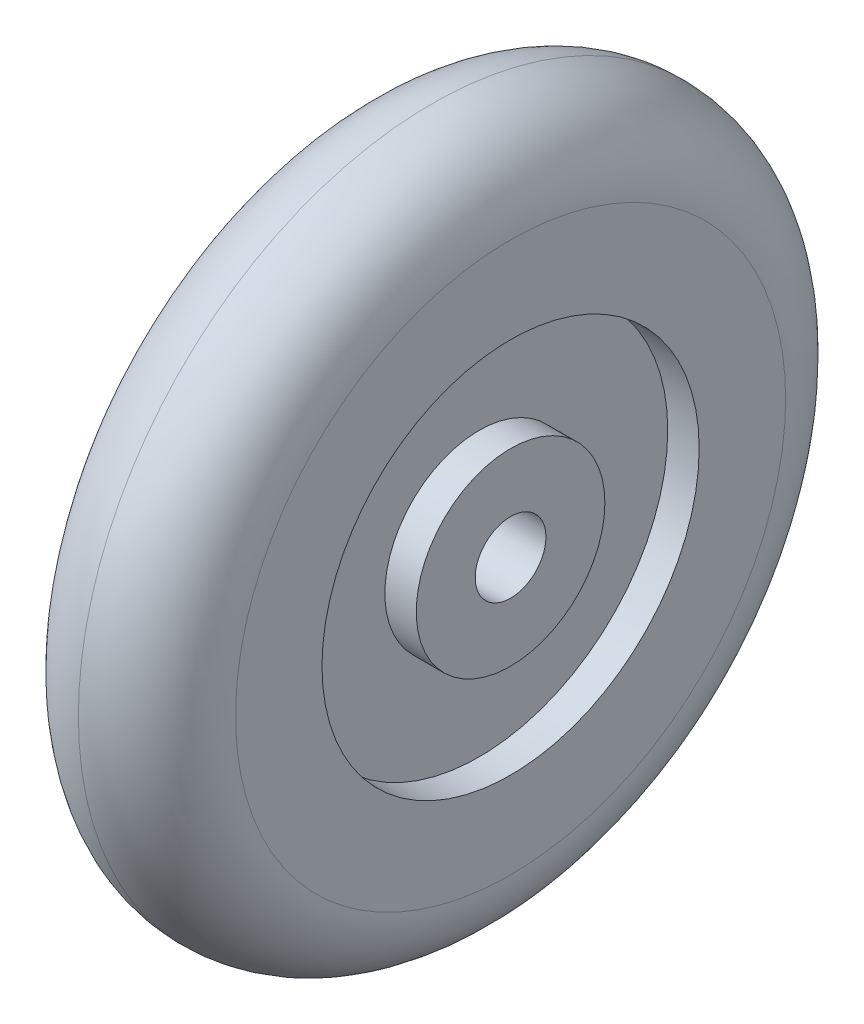
ISO-10303-21;
HEADER;
FILE_DESCRIPTION(('STEP AP214'),'2;1');
FILE_NAME('part.step','',(''),(''),'','','');
FILE_SCHEMA(('AUTOMOTIVE_DESIGN { 1 0 10303 214 1 1 1 1 }'));
ENDSEC;
DATA;
#1=APPLICATION_CONTEXT('core data for automotive mechanical design processes');
#2=APPLICATION_PROTOCOL_DEFINITION('international standard','automotive_design',2000,#1);
#3=PRODUCT_CONTEXT('',#1,'mechanical');
#4=PRODUCT('Part','Part','',(#3));
#5=PRODUCT_RELATED_PRODUCT_CATEGORY('part','',(#4));
#6=PRODUCT_DEFINITION_FORMATION('','',#4);
#7=PRODUCT_DEFINITION_CONTEXT('part definition',#1,'design');
#8=PRODUCT_DEFINITION('design','',#6,#7);
#9=PRODUCT_DEFINITION_SHAPE('','',#8);
#10=(LENGTH_UNIT() NAMED_UNIT(*) SI_UNIT(.MILLI.,.METRE.));
#11=(NAMED_UNIT(*) PLANE_ANGLE_UNIT() SI_UNIT($,.RADIAN.));
#12=(NAMED_UNIT(*) SI_UNIT($,.STERADIAN.) SOLID_ANGLE_UNIT());
#13=UNCERTAINTY_MEASURE_WITH_UNIT(LENGTH_MEASURE(1.E-05),#10,'distance_accuracy_value','');
#14=(GEOMETRIC_REPRESENTATION_CONTEXT(3) GLOBAL_UNCERTAINTY_ASSIGNED_CONTEXT((#13)) GLOBAL_UNIT_ASSIGNED_CONTEXT((#10,
#11,#12)) REPRESENTATION_CONTEXT('',''));
#15=CARTESIAN_POINT('',(0.,0.,0.));
#16=DIRECTION('',(0.,0.,1.));
#17=DIRECTION('',(1.,0.,0.));
#18=AXIS2_PLACEMENT_3D('',#15,#16,#17);
#19=CARTESIAN_POINT('',(5.,0.,0.));
#20=DIRECTION('',(1.,0.,0.));
#21=DIRECTION('',(0.,0.,-1.));
#22=AXIS2_PLACEMENT_3D('',#19,#20,#21);
#23=PLANE('',#22);
#24=CARTESIAN_POINT('',(5.,0.,0.));
#25=DIRECTION('',(1.,0.,0.));
#26=DIRECTION('',(0.,0.,-1.));
#27=AXIS2_PLACEMENT_3D('',#24,#25,#26);
#28=CIRCLE('',#27,12.);
#29=CARTESIAN_POINT('',(5.,0.,-12.));
#30=VERTEX_POINT('',#29);
#31=EDGE_CURVE('E61',#30,#30,#28,.T.);
#32=ORIENTED_EDGE('',*,*,#31,.F.);
#33=EDGE_LOOP('',(#32));
#34=FACE_BOUND('',#33,.T.);
#35=CARTESIAN_POINT('',(5.,0.,0.));
#36=DIRECTION('',(1.,0.,0.));
#37=DIRECTION('',(0.,0.,-1.));
#38=AXIS2_PLACEMENT_3D('',#35,#36,#37);
#39=CIRCLE('',#38,17.5);
#40=CARTESIAN_POINT('',(5.,0.,-17.5));
#41=VERTEX_POINT('',#40);
#42=EDGE_CURVE('E10',#41,#41,#39,.T.);
#43=ORIENTED_EDGE('',*,*,#42,.T.);
#44=EDGE_LOOP('',(#43));
#45=FACE_BOUND('',#44,.T.);
#46=ADVANCED_FACE('F50',(#34,#45),#23,.T.);
#47=CARTESIAN_POINT('',(-5.,0.,0.));
#48=DIRECTION('',(1.,0.,0.));
#49=DIRECTION('',(0.,0.,-1.));
#50=AXIS2_PLACEMENT_3D('',#47,#48,#49);
#51=PLANE('',#50);
#52=CARTESIAN_POINT('',(-5.,0.,0.));
#53=DIRECTION('',(1.,0.,0.));
#54=DIRECTION('',(0.,0.,-1.));
#55=AXIS2_PLACEMENT_3D('',#52,#53,#54);
#56=CIRCLE('',#55,12.);
#57=CARTESIAN_POINT('',(-5.,0.,-12.));
#58=VERTEX_POINT('',#57);
#59=EDGE_CURVE('E82',#58,#58,#56,.T.);
#60=ORIENTED_EDGE('',*,*,#59,.T.);
#61=EDGE_LOOP('',(#60));
#62=FACE_BOUND('',#61,.T.);
#63=CARTESIAN_POINT('',(-5.,0.,0.));
#64=DIRECTION('',(1.,0.,0.));
#65=DIRECTION('',(0.,0.,-1.));
#66=AXIS2_PLACEMENT_3D('',#63,#64,#65);
#67=CIRCLE('',#66,17.5);
#68=CARTESIAN_POINT('',(-5.,0.,-17.5));
#69=VERTEX_POINT('',#68);
#70=EDGE_CURVE('E57',#69,#69,#67,.F.);
#71=ORIENTED_EDGE('',*,*,#70,.T.);
#72=EDGE_LOOP('',(#71));
#73=FACE_BOUND('',#72,.T.);
#74=ADVANCED_FACE('F136',(#62,#73),#51,.F.);
#75=CARTESIAN_POINT('',(0.,0.,0.));
#76=DIRECTION('',(1.,0.,0.));
#77=DIRECTION('',(0.,0.,-1.));
#78=AXIS2_PLACEMENT_3D('',#75,#76,#77);
#79=TOROIDAL_SURFACE('',#78,17.5,5.);
#80=ORIENTED_EDGE('',*,*,#42,.F.);
#81=EDGE_LOOP('',(#80));
#82=FACE_BOUND('',#81,.T.);
#83=CARTESIAN_POINT('',(0.,0.,0.));
#84=DIRECTION('',(1.,0.,0.));
#85=DIRECTION('',(0.,0.,-1.));
#86=AXIS2_PLACEMENT_3D('',#83,#84,#85);
#87=CIRCLE('',#86,22.5);
#88=CARTESIAN_POINT('',(0.,0.,-22.5));
#89=VERTEX_POINT('',#88);
#90=EDGE_CURVE('E51',#89,#89,#87,.F.);
#91=ORIENTED_EDGE('',*,*,#90,.F.);
#92=EDGE_LOOP('',(#91));
#93=FACE_BOUND('',#92,.T.);
#94=ADVANCED_FACE('F47',(#82,#93),#79,.T.);
#95=CARTESIAN_POINT('',(0.,0.,0.));
#96=DIRECTION('',(1.,0.,0.));
#97=DIRECTION('',(0.,0.,-1.));
#98=AXIS2_PLACEMENT_3D('',#95,#96,#97);
#99=TOROIDAL_SURFACE('',#98,17.5,5.);
#100=ORIENTED_EDGE('',*,*,#70,.F.);
#101=EDGE_LOOP('',(#100));
#102=FACE_BOUND('',#101,.T.);
#103=ORIENTED_EDGE('',*,*,#90,.T.);
#104=EDGE_LOOP('',(#103));
#105=FACE_BOUND('',#104,.T.);
#106=ADVANCED_FACE('F143',(#102,#105),#99,.T.);
#107=CARTESIAN_POINT('',(3.,0.,0.));
#108=DIRECTION('',(1.,0.,0.));
#109=DIRECTION('',(0.,0.,-1.));
#110=AXIS2_PLACEMENT_3D('',#107,#108,#109);
#111=CYLINDRICAL_SURFACE('',#110,12.);
#112=CARTESIAN_POINT('',(3.,0.,0.));
#113=DIRECTION('',(1.,0.,0.));
#114=DIRECTION('',(0.,0.,-1.));
#115=AXIS2_PLACEMENT_3D('',#112,#113,#114);
#116=CIRCLE('',#115,12.);
#117=CARTESIAN_POINT('',(3.,0.,-12.));
#118=VERTEX_POINT('',#117);
#119=EDGE_CURVE('E67',#118,#118,#116,.T.);
#120=ORIENTED_EDGE('',*,*,#119,.F.);
#121=EDGE_LOOP('',(#120));
#122=FACE_BOUND('',#121,.T.);
#123=ORIENTED_EDGE('',*,*,#31,.T.);
#124=EDGE_LOOP('',(#123));
#125=FACE_BOUND('',#124,.T.);
#126=ADVANCED_FACE('F133',(#122,#125),#111,.F.);
#127=CARTESIAN_POINT('',(3.,0.,0.));
#128=DIRECTION('',(1.,0.,0.));
#129=DIRECTION('',(0.,0.,-1.));
#130=AXIS2_PLACEMENT_3D('',#127,#128,#129);
#131=PLANE('',#130);
#132=CARTESIAN_POINT('',(3.,0.,0.));
#133=DIRECTION('',(1.,0.,0.));
#134=DIRECTION('',(0.,0.,-1.));
#135=AXIS2_PLACEMENT_3D('',#132,#133,#134);
#136=CIRCLE('',#135,6.);
#137=CARTESIAN_POINT('',(3.,0.,-6.));
#138=VERTEX_POINT('',#137);
#139=EDGE_CURVE('E70',#138,#138,#136,.T.);
#140=ORIENTED_EDGE('',*,*,#139,.F.);
#141=EDGE_LOOP('',(#140));
#142=FACE_BOUND('',#141,.T.);
#143=ORIENTED_EDGE('',*,*,#119,.T.);
#144=EDGE_LOOP('',(#143));
#145=FACE_BOUND('',#144,.T.);
#146=ADVANCED_FACE('F121',(#142,#145),#131,.T.);
#147=CARTESIAN_POINT('',(3.,0.,0.));
#148=DIRECTION('',(1.,0.,0.));
#149=DIRECTION('',(0.,0.,-1.));
#150=AXIS2_PLACEMENT_3D('',#147,#148,#149);
#151=CYLINDRICAL_SURFACE('',#150,6.);
#152=ORIENTED_EDGE('',*,*,#139,.T.);
#153=EDGE_LOOP('',(#152));
#154=FACE_BOUND('',#153,.T.);
#155=CARTESIAN_POINT('',(5.,0.,0.));
#156=DIRECTION('',(1.,0.,0.));
#157=DIRECTION('',(0.,0.,-1.));
#158=AXIS2_PLACEMENT_3D('',#155,#156,#157);
#159=CIRCLE('',#158,6.);
#160=CARTESIAN_POINT('',(5.,0.,-6.));
#161=VERTEX_POINT('',#160);
#162=EDGE_CURVE('E72',#161,#161,#159,.T.);
#163=ORIENTED_EDGE('',*,*,#162,.F.);
#164=EDGE_LOOP('',(#163));
#165=FACE_BOUND('',#164,.T.);
#166=ADVANCED_FACE('F118',(#154,#165),#151,.T.);
#167=CARTESIAN_POINT('',(5.,0.,0.));
#168=DIRECTION('',(1.,0.,0.));
#169=DIRECTION('',(0.,0.,-1.));
#170=AXIS2_PLACEMENT_3D('',#167,#168,#169);
#171=CIRCLE('',#170,2.25);
#172=CARTESIAN_POINT('',(5.,0.,-2.25));
#173=VERTEX_POINT('',#172);
#174=EDGE_CURVE('E97',#173,#173,#171,.T.);
#175=ORIENTED_EDGE('',*,*,#174,.F.);
#176=EDGE_LOOP('',(#175));
#177=FACE_BOUND('',#176,.T.);
#178=ORIENTED_EDGE('',*,*,#162,.T.);
#179=EDGE_LOOP('',(#178));
#180=FACE_BOUND('',#179,.T.);
#181=ADVANCED_FACE('F114',(#177,#180),#23,.T.);
#182=CARTESIAN_POINT('',(-3.,0.,0.));
#183=DIRECTION('',(-1.,0.,0.));
#184=DIRECTION('',(0.,0.,-1.));
#185=AXIS2_PLACEMENT_3D('',#182,#183,#184);
#186=PLANE('',#185);
#187=CARTESIAN_POINT('',(-3.,0.,0.));
#188=DIRECTION('',(1.,0.,0.));
#189=DIRECTION('',(0.,0.,-1.));
#190=AXIS2_PLACEMENT_3D('',#187,#188,#189);
#191=CIRCLE('',#190,12.);
#192=CARTESIAN_POINT('',(-3.,0.,-12.));
#193=VERTEX_POINT('',#192);
#194=EDGE_CURVE('E80',#193,#193,#191,.T.);
#195=ORIENTED_EDGE('',*,*,#194,.F.);
#196=EDGE_LOOP('',(#195));
#197=FACE_BOUND('',#196,.T.);
#198=CARTESIAN_POINT('',(-3.,0.,0.));
#199=DIRECTION('',(1.,0.,0.));
#200=DIRECTION('',(0.,0.,-1.));
#201=AXIS2_PLACEMENT_3D('',#198,#199,#200);
#202=CIRCLE('',#201,6.);
#203=CARTESIAN_POINT('',(-3.,0.,-6.));
#204=VERTEX_POINT('',#203);
#205=EDGE_CURVE('E83',#204,#204,#202,.T.);
#206=ORIENTED_EDGE('',*,*,#205,.T.);
#207=EDGE_LOOP('',(#206));
#208=FACE_BOUND('',#207,.T.);
#209=ADVANCED_FACE('F117',(#197,#208),#186,.T.);
#210=CARTESIAN_POINT('',(-3.,0.,0.));
#211=DIRECTION('',(-1.,0.,0.));
#212=DIRECTION('',(0.,0.,1.));
#213=AXIS2_PLACEMENT_3D('',#210,#211,#212);
#214=CYLINDRICAL_SURFACE('',#213,12.);
#215=ORIENTED_EDGE('',*,*,#194,.T.);
#216=EDGE_LOOP('',(#215));
#217=FACE_BOUND('',#216,.T.);
#218=ORIENTED_EDGE('',*,*,#59,.F.);
#219=EDGE_LOOP('',(#218));
#220=FACE_BOUND('',#219,.T.);
#221=ADVANCED_FACE('F224',(#217,#220),#214,.F.);
#222=CARTESIAN_POINT('',(-3.,0.,0.));
#223=DIRECTION('',(-1.,0.,0.));
#224=DIRECTION('',(0.,0.,1.));
#225=AXIS2_PLACEMENT_3D('',#222,#223,#224);
#226=CYLINDRICAL_SURFACE('',#225,6.);
#227=ORIENTED_EDGE('',*,*,#205,.F.);
#228=EDGE_LOOP('',(#227));
#229=FACE_BOUND('',#228,.T.);
#230=CARTESIAN_POINT('',(-5.,0.,0.));
#231=DIRECTION('',(1.,0.,0.));
#232=DIRECTION('',(0.,0.,-1.));
#233=AXIS2_PLACEMENT_3D('',#230,#231,#232);
#234=CIRCLE('',#233,6.);
#235=CARTESIAN_POINT('',(-5.,0.,-6.));
#236=VERTEX_POINT('',#235);
#237=EDGE_CURVE('E90',#236,#236,#234,.T.);
#238=ORIENTED_EDGE('',*,*,#237,.T.);
#239=EDGE_LOOP('',(#238));
#240=FACE_BOUND('',#239,.T.);
#241=ADVANCED_FACE('F211',(#229,#240),#226,.T.);
#242=CARTESIAN_POINT('',(-5.,0.,0.));
#243=DIRECTION('',(1.,0.,0.));
#244=DIRECTION('',(0.,0.,-1.));
#245=AXIS2_PLACEMENT_3D('',#242,#243,#244);
#246=CIRCLE('',#245,2.25);
#247=CARTESIAN_POINT('',(-5.,0.,-2.25));
#248=VERTEX_POINT('',#247);
#249=EDGE_CURVE('E95',#248,#248,#246,.T.);
#250=ORIENTED_EDGE('',*,*,#249,.T.);
#251=EDGE_LOOP('',(#250));
#252=FACE_BOUND('',#251,.T.);
#253=ORIENTED_EDGE('',*,*,#237,.F.);
#254=EDGE_LOOP('',(#253));
#255=FACE_BOUND('',#254,.T.);
#256=ADVANCED_FACE('F106',(#252,#255),#51,.F.);
#257=CARTESIAN_POINT('',(-5.,0.,0.));
#258=DIRECTION('',(1.,0.,0.));
#259=DIRECTION('',(0.,0.,-1.));
#260=AXIS2_PLACEMENT_3D('',#257,#258,#259);
#261=CYLINDRICAL_SURFACE('',#260,2.25);
#262=ORIENTED_EDGE('',*,*,#249,.F.);
#263=EDGE_LOOP('',(#262));
#264=FACE_BOUND('',#263,.T.);
#265=ORIENTED_EDGE('',*,*,#174,.T.);
#266=EDGE_LOOP('',(#265));
#267=FACE_BOUND('',#266,.T.);
#268=ADVANCED_FACE('F107',(#264,#267),#261,.F.);
#269=CLOSED_SHELL('',(#46,#74,#94,#106,#126,#146,#166,#181,#209,#221,#241,#256,#268));
#270=MANIFOLD_SOLID_BREP('B2',#269);
#271=ADVANCED_BREP_SHAPE_REPRESENTATION('',(#18,#270),#14);
#272=SHAPE_DEFINITION_REPRESENTATION(#9,#271);
ENDSEC;
END-ISO-10303-21;
